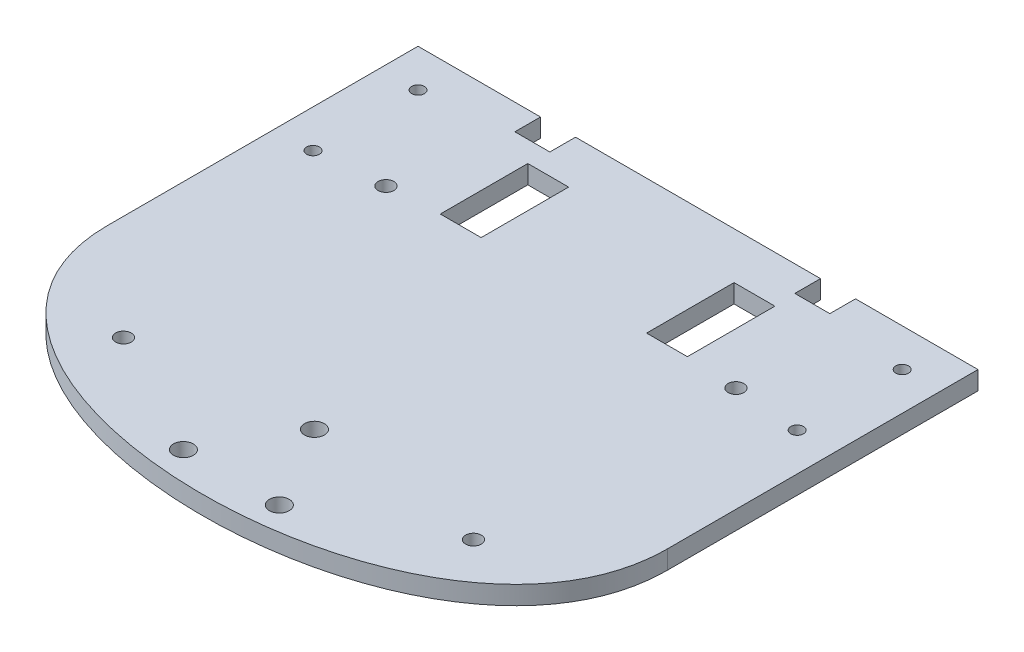
ISO-10303-21;
HEADER;
FILE_DESCRIPTION(('STEP AP214'),'2;1');
FILE_NAME('part.step','',(''),(''),'','','');
FILE_SCHEMA(('AUTOMOTIVE_DESIGN { 1 0 10303 214 1 1 1 1 }'));
ENDSEC;
DATA;
#1=APPLICATION_CONTEXT('core data for automotive mechanical design processes');
#2=APPLICATION_PROTOCOL_DEFINITION('international standard','automotive_design',2000,#1);
#3=PRODUCT_CONTEXT('',#1,'mechanical');
#4=PRODUCT('Part','Part','',(#3));
#5=PRODUCT_RELATED_PRODUCT_CATEGORY('part','',(#4));
#6=PRODUCT_DEFINITION_FORMATION('','',#4);
#7=PRODUCT_DEFINITION_CONTEXT('part definition',#1,'design');
#8=PRODUCT_DEFINITION('design','',#6,#7);
#9=PRODUCT_DEFINITION_SHAPE('','',#8);
#10=(LENGTH_UNIT() NAMED_UNIT(*) SI_UNIT(.MILLI.,.METRE.));
#11=(NAMED_UNIT(*) PLANE_ANGLE_UNIT() SI_UNIT($,.RADIAN.));
#12=(NAMED_UNIT(*) SI_UNIT($,.STERADIAN.) SOLID_ANGLE_UNIT());
#13=UNCERTAINTY_MEASURE_WITH_UNIT(LENGTH_MEASURE(1.E-05),#10,'distance_accuracy_value','');
#14=(GEOMETRIC_REPRESENTATION_CONTEXT(3) GLOBAL_UNCERTAINTY_ASSIGNED_CONTEXT((#13)) GLOBAL_UNIT_ASSIGNED_CONTEXT((#10,
#11,#12)) REPRESENTATION_CONTEXT('',''));
#15=CARTESIAN_POINT('',(0.,0.,0.));
#16=DIRECTION('',(0.,0.,1.));
#17=DIRECTION('',(1.,0.,0.));
#18=AXIS2_PLACEMENT_3D('',#15,#16,#17);
#19=CARTESIAN_POINT('',(48.,3.175,-42.5));
#20=DIRECTION('',(0.,0.,1.));
#21=DIRECTION('',(1.,0.,0.));
#22=AXIS2_PLACEMENT_3D('',#19,#20,#21);
#23=PLANE('',#22);
#24=DIRECTION('',(-1.,0.,0.));
#25=VECTOR('',#24,1.);
#26=CARTESIAN_POINT('',(48.,3.175,-42.5));
#27=LINE('',#26,#25);
#28=CARTESIAN_POINT('',(21.,3.175,-42.5));
#29=VERTEX_POINT('',#28);
#30=CARTESIAN_POINT('',(-21.,3.175,-42.4999999999998));
#31=VERTEX_POINT('',#30);
#32=EDGE_CURVE('E578',#29,#31,#27,.T.);
#33=ORIENTED_EDGE('',*,*,#32,.F.);
#34=DIRECTION('',(0.,1.,0.));
#35=VECTOR('',#34,1.);
#36=CARTESIAN_POINT('',(21.,0.,-42.5));
#37=LINE('',#36,#35);
#38=CARTESIAN_POINT('',(21.,0.,-42.5));
#39=VERTEX_POINT('',#38);
#40=EDGE_CURVE('E215',#39,#29,#37,.T.);
#41=ORIENTED_EDGE('',*,*,#40,.F.);
#42=DIRECTION('',(-1.,0.,0.));
#43=VECTOR('',#42,1.);
#44=CARTESIAN_POINT('',(48.,0.,-42.5));
#45=LINE('',#44,#43);
#46=CARTESIAN_POINT('',(-21.,0.,-42.4999999999998));
#47=VERTEX_POINT('',#46);
#48=EDGE_CURVE('E200',#39,#47,#45,.T.);
#49=ORIENTED_EDGE('',*,*,#48,.T.);
#50=DIRECTION('',(0.,1.,0.));
#51=VECTOR('',#50,1.);
#52=CARTESIAN_POINT('',(-21.,0.,-42.4999999999998));
#53=LINE('',#52,#51);
#54=EDGE_CURVE('E249',#47,#31,#53,.T.);
#55=ORIENTED_EDGE('',*,*,#54,.T.);
#56=EDGE_LOOP('',(#33,#41,#49,#55));
#57=FACE_BOUND('',#56,.T.);
#58=ADVANCED_FACE('F39',(#57),#23,.F.);
#59=CARTESIAN_POINT('',(-27.,3.175,-42.4999999999998));
#60=VERTEX_POINT('',#59);
#61=CARTESIAN_POINT('',(-48.,3.175,-42.5));
#62=VERTEX_POINT('',#61);
#63=EDGE_CURVE('E583',#60,#62,#27,.T.);
#64=ORIENTED_EDGE('',*,*,#63,.F.);
#65=DIRECTION('',(0.,1.,0.));
#66=VECTOR('',#65,1.);
#67=CARTESIAN_POINT('',(-27.,0.,-42.4999999999998));
#68=LINE('',#67,#66);
#69=CARTESIAN_POINT('',(-27.,0.,-42.4999999999998));
#70=VERTEX_POINT('',#69);
#71=EDGE_CURVE('E212',#70,#60,#68,.T.);
#72=ORIENTED_EDGE('',*,*,#71,.F.);
#73=CARTESIAN_POINT('',(-48.,0.,-42.5));
#74=VERTEX_POINT('',#73);
#75=EDGE_CURVE('E603',#70,#74,#45,.T.);
#76=ORIENTED_EDGE('',*,*,#75,.T.);
#77=DIRECTION('',(0.,-1.,0.));
#78=VECTOR('',#77,1.);
#79=CARTESIAN_POINT('',(-48.,3.175,-42.5));
#80=LINE('',#79,#78);
#81=EDGE_CURVE('E587',#62,#74,#80,.T.);
#82=ORIENTED_EDGE('',*,*,#81,.F.);
#83=EDGE_LOOP('',(#64,#72,#76,#82));
#84=FACE_BOUND('',#83,.T.);
#85=ADVANCED_FACE('F469',(#84),#23,.F.);
#86=CARTESIAN_POINT('',(-48.,3.175,-42.5));
#87=DIRECTION('',(1.,0.,0.));
#88=DIRECTION('',(0.,0.,-1.));
#89=AXIS2_PLACEMENT_3D('',#86,#87,#88);
#90=PLANE('',#89);
#91=DIRECTION('',(0.,0.,1.));
#92=VECTOR('',#91,1.);
#93=CARTESIAN_POINT('',(-48.,0.,-42.5));
#94=LINE('',#93,#92);
#95=CARTESIAN_POINT('',(-48.,0.,10.75));
#96=VERTEX_POINT('',#95);
#97=EDGE_CURVE('E439',#74,#96,#94,.T.);
#98=ORIENTED_EDGE('',*,*,#97,.T.);
#99=DIRECTION('',(0.,-1.,0.));
#100=VECTOR('',#99,1.);
#101=CARTESIAN_POINT('',(-48.,3.175,10.75));
#102=LINE('',#101,#100);
#103=CARTESIAN_POINT('',(-48.,3.175,10.75));
#104=VERTEX_POINT('',#103);
#105=EDGE_CURVE('E11',#104,#96,#102,.T.);
#106=ORIENTED_EDGE('',*,*,#105,.F.);
#107=DIRECTION('',(0.,0.,1.));
#108=VECTOR('',#107,1.);
#109=CARTESIAN_POINT('',(-48.,3.175,-42.5));
#110=LINE('',#109,#108);
#111=EDGE_CURVE('E440',#62,#104,#110,.T.);
#112=ORIENTED_EDGE('',*,*,#111,.F.);
#113=ORIENTED_EDGE('',*,*,#81,.T.);
#114=EDGE_LOOP('',(#98,#106,#112,#113));
#115=FACE_BOUND('',#114,.T.);
#116=ADVANCED_FACE('F41',(#115),#90,.F.);
#117=CARTESIAN_POINT('',(-48.,3.175,10.75));
#118=CARTESIAN_POINT('',(-48.,3.175,53.0833333333333));
#119=CARTESIAN_POINT('',(48.0000000000003,3.175,53.0833333333333));
#120=CARTESIAN_POINT('',(48.,3.175,10.75));
#121=B_SPLINE_CURVE_WITH_KNOTS('',3,(#117,#118,#119,#120),.UNSPECIFIED.,.F.,.F.,(4,4),(0.,1.),.UNSPECIFIED.);
#122=DIRECTION('',(0.,-1.,0.));
#123=VECTOR('',#122,1.);
#124=SURFACE_OF_LINEAR_EXTRUSION('',#121,#123);
#125=CARTESIAN_POINT('',(-48.,0.,10.75));
#126=CARTESIAN_POINT('',(-48.,0.,53.0833333333333));
#127=CARTESIAN_POINT('',(48.0000000000003,0.,53.0833333333333));
#128=CARTESIAN_POINT('',(48.,0.,10.75));
#129=B_SPLINE_CURVE_WITH_KNOTS('',3,(#125,#126,#127,#128),.UNSPECIFIED.,.F.,.F.,(4,4),(0.,1.),.UNSPECIFIED.);
#130=CARTESIAN_POINT('',(48.,0.,10.75));
#131=VERTEX_POINT('',#130);
#132=EDGE_CURVE('E592',#96,#131,#129,.T.);
#133=ORIENTED_EDGE('',*,*,#132,.T.);
#134=DIRECTION('',(0.,-1.,0.));
#135=VECTOR('',#134,1.);
#136=CARTESIAN_POINT('',(48.,3.175,10.75));
#137=LINE('',#136,#135);
#138=CARTESIAN_POINT('',(48.,3.175,10.75));
#139=VERTEX_POINT('',#138);
#140=EDGE_CURVE('E48',#139,#131,#137,.T.);
#141=ORIENTED_EDGE('',*,*,#140,.F.);
#142=EDGE_CURVE('E444',#104,#139,#121,.T.);
#143=ORIENTED_EDGE('',*,*,#142,.F.);
#144=ORIENTED_EDGE('',*,*,#105,.T.);
#145=EDGE_LOOP('',(#133,#141,#143,#144));
#146=FACE_BOUND('',#145,.T.);
#147=ADVANCED_FACE('F456',(#146),#124,.F.);
#148=CARTESIAN_POINT('',(48.,3.175,-42.5));
#149=DIRECTION('',(-1.,0.,0.));
#150=DIRECTION('',(0.,0.,1.));
#151=AXIS2_PLACEMENT_3D('',#148,#149,#150);
#152=PLANE('',#151);
#153=DIRECTION('',(0.,0.,-1.));
#154=VECTOR('',#153,1.);
#155=CARTESIAN_POINT('',(48.,0.,-42.5));
#156=LINE('',#155,#154);
#157=CARTESIAN_POINT('',(48.,0.,-42.5));
#158=VERTEX_POINT('',#157);
#159=EDGE_CURVE('E597',#131,#158,#156,.T.);
#160=ORIENTED_EDGE('',*,*,#159,.T.);
#161=DIRECTION('',(0.,-1.,0.));
#162=VECTOR('',#161,1.);
#163=CARTESIAN_POINT('',(48.,3.175,-42.5));
#164=LINE('',#163,#162);
#165=CARTESIAN_POINT('',(48.,3.175,-42.5));
#166=VERTEX_POINT('',#165);
#167=EDGE_CURVE('E610',#166,#158,#164,.T.);
#168=ORIENTED_EDGE('',*,*,#167,.F.);
#169=DIRECTION('',(0.,0.,-1.));
#170=VECTOR('',#169,1.);
#171=CARTESIAN_POINT('',(48.,3.175,-42.5));
#172=LINE('',#171,#170);
#173=EDGE_CURVE('E451',#139,#166,#172,.T.);
#174=ORIENTED_EDGE('',*,*,#173,.F.);
#175=ORIENTED_EDGE('',*,*,#140,.T.);
#176=EDGE_LOOP('',(#160,#168,#174,#175));
#177=FACE_BOUND('',#176,.T.);
#178=ADVANCED_FACE('F459',(#177),#152,.F.);
#179=CARTESIAN_POINT('',(27.,0.,-42.5));
#180=VERTEX_POINT('',#179);
#181=EDGE_CURVE('E445',#158,#180,#45,.T.);
#182=ORIENTED_EDGE('',*,*,#181,.T.);
#183=DIRECTION('',(0.,1.,0.));
#184=VECTOR('',#183,1.);
#185=CARTESIAN_POINT('',(27.,0.,-42.5));
#186=LINE('',#185,#184);
#187=CARTESIAN_POINT('',(27.,3.175,-42.5));
#188=VERTEX_POINT('',#187);
#189=EDGE_CURVE('E219',#180,#188,#186,.T.);
#190=ORIENTED_EDGE('',*,*,#189,.T.);
#191=EDGE_CURVE('E582',#166,#188,#27,.T.);
#192=ORIENTED_EDGE('',*,*,#191,.F.);
#193=ORIENTED_EDGE('',*,*,#167,.T.);
#194=EDGE_LOOP('',(#182,#190,#192,#193));
#195=FACE_BOUND('',#194,.T.);
#196=ADVANCED_FACE('F463',(#195),#23,.F.);
#197=CARTESIAN_POINT('',(1.21430643318376E-13,3.175,42.5));
#198=DIRECTION('',(0.,-1.,0.));
#199=DIRECTION('',(0.,0.,-1.));
#200=AXIS2_PLACEMENT_3D('',#197,#198,#199);
#201=PLANE('',#200);
#202=CARTESIAN_POINT('',(30.,3.175,26.));
#203=DIRECTION('',(0.,-1.,0.));
#204=DIRECTION('',(0.,0.,-1.));
#205=AXIS2_PLACEMENT_3D('',#202,#203,#204);
#206=CIRCLE('',#205,1.35000000000004);
#207=CARTESIAN_POINT('',(30.,3.175,24.65));
#208=VERTEX_POINT('',#207);
#209=EDGE_CURVE('E435',#208,#208,#206,.T.);
#210=ORIENTED_EDGE('',*,*,#209,.T.);
#211=EDGE_LOOP('',(#210));
#212=FACE_BOUND('',#211,.T.);
#213=CARTESIAN_POINT('',(-30.,3.175,26.));
#214=DIRECTION('',(0.,-1.,0.));
#215=DIRECTION('',(0.,0.,-1.));
#216=AXIS2_PLACEMENT_3D('',#213,#214,#215);
#217=CIRCLE('',#216,1.35);
#218=CARTESIAN_POINT('',(-30.,3.175,24.65));
#219=VERTEX_POINT('',#218);
#220=EDGE_CURVE('E431',#219,#219,#217,.T.);
#221=ORIENTED_EDGE('',*,*,#220,.T.);
#222=EDGE_LOOP('',(#221));
#223=FACE_BOUND('',#222,.T.);
#224=CARTESIAN_POINT('',(41.5,3.175,-36.));
#225=DIRECTION('',(0.,-1.,0.));
#226=DIRECTION('',(0.,0.,-1.));
#227=AXIS2_PLACEMENT_3D('',#224,#225,#226);
#228=CIRCLE('',#227,1.09219999999998);
#229=CARTESIAN_POINT('',(41.5,3.175,-37.0922));
#230=VERTEX_POINT('',#229);
#231=EDGE_CURVE('E427',#230,#230,#228,.T.);
#232=ORIENTED_EDGE('',*,*,#231,.T.);
#233=EDGE_LOOP('',(#232));
#234=FACE_BOUND('',#233,.T.);
#235=CARTESIAN_POINT('',(41.5,3.175,-18.));
#236=DIRECTION('',(0.,-1.,0.));
#237=DIRECTION('',(0.,0.,-1.));
#238=AXIS2_PLACEMENT_3D('',#235,#236,#237);
#239=CIRCLE('',#238,1.09219999999998);
#240=CARTESIAN_POINT('',(41.5,3.175,-19.0922));
#241=VERTEX_POINT('',#240);
#242=EDGE_CURVE('E423',#241,#241,#239,.T.);
#243=ORIENTED_EDGE('',*,*,#242,.T.);
#244=EDGE_LOOP('',(#243));
#245=FACE_BOUND('',#244,.T.);
#246=CARTESIAN_POINT('',(0.,3.175,23.253882107746));
#247=DIRECTION('',(0.,-1.,0.));
#248=DIRECTION('',(0.,0.,-1.));
#249=AXIS2_PLACEMENT_3D('',#246,#247,#248);
#250=CIRCLE('',#249,1.7);
#251=CARTESIAN_POINT('',(0.,3.175,21.553882107746));
#252=VERTEX_POINT('',#251);
#253=EDGE_CURVE('E419',#252,#252,#250,.T.);
#254=ORIENTED_EDGE('',*,*,#253,.T.);
#255=EDGE_LOOP('',(#254));
#256=FACE_BOUND('',#255,.T.);
#257=CARTESIAN_POINT('',(-41.5,3.175,-36.));
#258=DIRECTION('',(0.,-1.,0.));
#259=DIRECTION('',(0.,0.,-1.));
#260=AXIS2_PLACEMENT_3D('',#257,#258,#259);
#261=CIRCLE('',#260,1.0922);
#262=CARTESIAN_POINT('',(-41.5,3.175,-37.0922));
#263=VERTEX_POINT('',#262);
#264=EDGE_CURVE('E415',#263,#263,#261,.T.);
#265=ORIENTED_EDGE('',*,*,#264,.T.);
#266=EDGE_LOOP('',(#265));
#267=FACE_BOUND('',#266,.T.);
#268=CARTESIAN_POINT('',(-30.,3.175,-19.));
#269=DIRECTION('',(0.,-1.,0.));
#270=DIRECTION('',(0.,0.,-1.));
#271=AXIS2_PLACEMENT_3D('',#268,#269,#270);
#272=CIRCLE('',#271,1.35);
#273=CARTESIAN_POINT('',(-30.,3.175,-20.35));
#274=VERTEX_POINT('',#273);
#275=EDGE_CURVE('E411',#274,#274,#272,.T.);
#276=ORIENTED_EDGE('',*,*,#275,.T.);
#277=EDGE_LOOP('',(#276));
#278=FACE_BOUND('',#277,.T.);
#279=CARTESIAN_POINT('',(-41.5,3.175,-18.));
#280=DIRECTION('',(0.,-1.,0.));
#281=DIRECTION('',(0.,0.,-1.));
#282=AXIS2_PLACEMENT_3D('',#279,#280,#281);
#283=CIRCLE('',#282,1.0922);
#284=CARTESIAN_POINT('',(-41.5,3.175,-19.0922));
#285=VERTEX_POINT('',#284);
#286=EDGE_CURVE('E407',#285,#285,#283,.T.);
#287=ORIENTED_EDGE('',*,*,#286,.T.);
#288=EDGE_LOOP('',(#287));
#289=FACE_BOUND('',#288,.T.);
#290=CARTESIAN_POINT('',(8.225,3.175,37.5));
#291=DIRECTION('',(0.,-1.,0.));
#292=DIRECTION('',(0.,0.,-1.));
#293=AXIS2_PLACEMENT_3D('',#290,#291,#292);
#294=CIRCLE('',#293,1.7);
#295=CARTESIAN_POINT('',(8.225,3.175,35.8));
#296=VERTEX_POINT('',#295);
#297=EDGE_CURVE('E403',#296,#296,#294,.T.);
#298=ORIENTED_EDGE('',*,*,#297,.T.);
#299=EDGE_LOOP('',(#298));
#300=FACE_BOUND('',#299,.T.);
#301=DIRECTION('',(-1.,0.,0.));
#302=VECTOR('',#301,1.);
#303=CARTESIAN_POINT('',(1.52160030607109E-13,3.175,-19.5));
#304=LINE('',#303,#302);
#305=CARTESIAN_POINT('',(-14.18,3.175,-19.5));
#306=VERTEX_POINT('',#305);
#307=CARTESIAN_POINT('',(-21.18,3.175,-19.5));
#308=VERTEX_POINT('',#307);
#309=EDGE_CURVE('E387',#306,#308,#304,.T.);
#310=ORIENTED_EDGE('',*,*,#309,.T.);
#311=DIRECTION('',(0.,0.,-1.));
#312=VECTOR('',#311,1.);
#313=CARTESIAN_POINT('',(-21.18,3.175,42.5));
#314=LINE('',#313,#312);
#315=CARTESIAN_POINT('',(-21.18,3.175,-34.5));
#316=VERTEX_POINT('',#315);
#317=EDGE_CURVE('E399',#308,#316,#314,.T.);
#318=ORIENTED_EDGE('',*,*,#317,.T.);
#319=DIRECTION('',(1.,0.,0.));
#320=VECTOR('',#319,1.);
#321=CARTESIAN_POINT('',(1.21430643318376E-13,3.175,-34.5));
#322=LINE('',#321,#320);
#323=CARTESIAN_POINT('',(-14.18,3.175,-34.5));
#324=VERTEX_POINT('',#323);
#325=EDGE_CURVE('E395',#316,#324,#322,.T.);
#326=ORIENTED_EDGE('',*,*,#325,.T.);
#327=DIRECTION('',(0.,0.,1.));
#328=VECTOR('',#327,1.);
#329=CARTESIAN_POINT('',(-14.18,3.175,42.5));
#330=LINE('',#329,#328);
#331=EDGE_CURVE('E391',#324,#306,#330,.T.);
#332=ORIENTED_EDGE('',*,*,#331,.T.);
#333=EDGE_LOOP('',(#310,#318,#326,#332));
#334=FACE_BOUND('',#333,.T.);
#335=CARTESIAN_POINT('',(-8.225,3.175,37.5));
#336=DIRECTION('',(0.,-1.,0.));
#337=DIRECTION('',(0.,0.,-1.));
#338=AXIS2_PLACEMENT_3D('',#335,#336,#337);
#339=CIRCLE('',#338,1.7);
#340=CARTESIAN_POINT('',(-8.225,3.175,35.8));
#341=VERTEX_POINT('',#340);
#342=EDGE_CURVE('E383',#341,#341,#339,.T.);
#343=ORIENTED_EDGE('',*,*,#342,.T.);
#344=EDGE_LOOP('',(#343));
#345=FACE_BOUND('',#344,.T.);
#346=CARTESIAN_POINT('',(30.,3.175,-19.));
#347=DIRECTION('',(0.,-1.,0.));
#348=DIRECTION('',(0.,0.,-1.));
#349=AXIS2_PLACEMENT_3D('',#346,#347,#348);
#350=CIRCLE('',#349,1.35);
#351=CARTESIAN_POINT('',(30.,3.175,-20.35));
#352=VERTEX_POINT('',#351);
#353=EDGE_CURVE('E379',#352,#352,#350,.T.);
#354=ORIENTED_EDGE('',*,*,#353,.T.);
#355=EDGE_LOOP('',(#354));
#356=FACE_BOUND('',#355,.T.);
#357=DIRECTION('',(-1.,0.,0.));
#358=VECTOR('',#357,1.);
#359=CARTESIAN_POINT('',(1.21430643318376E-13,3.175,-19.5));
#360=LINE('',#359,#358);
#361=CARTESIAN_POINT('',(21.18,3.175,-19.5));
#362=VERTEX_POINT('',#361);
#363=CARTESIAN_POINT('',(14.18,3.175,-19.5));
#364=VERTEX_POINT('',#363);
#365=EDGE_CURVE('E353',#362,#364,#360,.T.);
#366=ORIENTED_EDGE('',*,*,#365,.T.);
#367=DIRECTION('',(0.,0.,-1.));
#368=VECTOR('',#367,1.);
#369=CARTESIAN_POINT('',(14.18,3.175,42.5));
#370=LINE('',#369,#368);
#371=CARTESIAN_POINT('',(14.18,3.175,-34.5));
#372=VERTEX_POINT('',#371);
#373=EDGE_CURVE('E375',#364,#372,#370,.T.);
#374=ORIENTED_EDGE('',*,*,#373,.T.);
#375=DIRECTION('',(1.,0.,0.));
#376=VECTOR('',#375,1.);
#377=CARTESIAN_POINT('',(1.21430643318376E-13,3.175,-34.5));
#378=LINE('',#377,#376);
#379=CARTESIAN_POINT('',(21.18,3.175,-34.5));
#380=VERTEX_POINT('',#379);
#381=EDGE_CURVE('E371',#372,#380,#378,.T.);
#382=ORIENTED_EDGE('',*,*,#381,.T.);
#383=DIRECTION('',(0.,0.,1.));
#384=VECTOR('',#383,1.);
#385=CARTESIAN_POINT('',(21.18,3.175,42.5));
#386=LINE('',#385,#384);
#387=EDGE_CURVE('E367',#380,#362,#386,.T.);
#388=ORIENTED_EDGE('',*,*,#387,.T.);
#389=EDGE_LOOP('',(#366,#374,#382,#388));
#390=FACE_BOUND('',#389,.T.);
#391=DIRECTION('',(1.,0.,0.));
#392=VECTOR('',#391,1.);
#393=CARTESIAN_POINT('',(21.,3.175,-38.1));
#394=LINE('',#393,#392);
#395=CARTESIAN_POINT('',(21.,3.175,-38.1));
#396=VERTEX_POINT('',#395);
#397=CARTESIAN_POINT('',(27.,3.175,-38.1));
#398=VERTEX_POINT('',#397);
#399=EDGE_CURVE('E205',#396,#398,#394,.T.);
#400=ORIENTED_EDGE('',*,*,#399,.F.);
#401=DIRECTION('',(0.,0.,1.));
#402=VECTOR('',#401,1.);
#403=CARTESIAN_POINT('',(21.,3.175,-42.5));
#404=LINE('',#403,#402);
#405=EDGE_CURVE('E183',#29,#396,#404,.T.);
#406=ORIENTED_EDGE('',*,*,#405,.F.);
#407=ORIENTED_EDGE('',*,*,#32,.T.);
#408=DIRECTION('',(0.,0.,-1.));
#409=VECTOR('',#408,1.);
#410=CARTESIAN_POINT('',(-21.,3.175,-42.4999999999998));
#411=LINE('',#410,#409);
#412=CARTESIAN_POINT('',(-21.,3.175,-38.1));
#413=VERTEX_POINT('',#412);
#414=EDGE_CURVE('E230',#413,#31,#411,.T.);
#415=ORIENTED_EDGE('',*,*,#414,.F.);
#416=DIRECTION('',(1.,0.,0.));
#417=VECTOR('',#416,1.);
#418=CARTESIAN_POINT('',(-27.,3.175,-38.1));
#419=LINE('',#418,#417);
#420=CARTESIAN_POINT('',(-27.,3.175,-38.1));
#421=VERTEX_POINT('',#420);
#422=EDGE_CURVE('E241',#421,#413,#419,.T.);
#423=ORIENTED_EDGE('',*,*,#422,.F.);
#424=DIRECTION('',(0.,0.,1.));
#425=VECTOR('',#424,1.);
#426=CARTESIAN_POINT('',(-27.,3.175,-42.4999999999998));
#427=LINE('',#426,#425);
#428=EDGE_CURVE('E237',#60,#421,#427,.T.);
#429=ORIENTED_EDGE('',*,*,#428,.F.);
#430=ORIENTED_EDGE('',*,*,#63,.T.);
#431=ORIENTED_EDGE('',*,*,#111,.T.);
#432=ORIENTED_EDGE('',*,*,#142,.T.);
#433=ORIENTED_EDGE('',*,*,#173,.T.);
#434=ORIENTED_EDGE('',*,*,#191,.T.);
#435=DIRECTION('',(0.,0.,-1.));
#436=VECTOR('',#435,1.);
#437=CARTESIAN_POINT('',(27.,3.175,-42.5));
#438=LINE('',#437,#436);
#439=EDGE_CURVE('E202',#398,#188,#438,.T.);
#440=ORIENTED_EDGE('',*,*,#439,.F.);
#441=EDGE_LOOP('',(#400,#406,#407,#415,#423,#429,#430,#431,#432,#433,#434,#440));
#442=FACE_BOUND('',#441,.T.);
#443=ADVANCED_FACE('F467',(#212,#223,#234,#245,#256,#267,#278,#289,#300,#334,#345,#356,#390,
#442),#201,.F.);
#444=CARTESIAN_POINT('',(1.21430643318376E-13,0.,42.5));
#445=DIRECTION('',(0.,-1.,0.));
#446=DIRECTION('',(0.,0.,-1.));
#447=AXIS2_PLACEMENT_3D('',#444,#445,#446);
#448=PLANE('',#447);
#449=DIRECTION('',(0.,0.,1.));
#450=VECTOR('',#449,1.);
#451=CARTESIAN_POINT('',(21.,0.,-42.5));
#452=LINE('',#451,#450);
#453=CARTESIAN_POINT('',(21.,0.,-38.1));
#454=VERTEX_POINT('',#453);
#455=EDGE_CURVE('E180',#39,#454,#452,.T.);
#456=ORIENTED_EDGE('',*,*,#455,.T.);
#457=DIRECTION('',(1.,0.,0.));
#458=VECTOR('',#457,1.);
#459=CARTESIAN_POINT('',(21.,0.,-38.1));
#460=LINE('',#459,#458);
#461=CARTESIAN_POINT('',(27.,0.,-38.1));
#462=VERTEX_POINT('',#461);
#463=EDGE_CURVE('E191',#454,#462,#460,.T.);
#464=ORIENTED_EDGE('',*,*,#463,.T.);
#465=DIRECTION('',(0.,0.,-1.));
#466=VECTOR('',#465,1.);
#467=CARTESIAN_POINT('',(27.,0.,-42.5));
#468=LINE('',#467,#466);
#469=EDGE_CURVE('E55',#462,#180,#468,.T.);
#470=ORIENTED_EDGE('',*,*,#469,.T.);
#471=ORIENTED_EDGE('',*,*,#181,.F.);
#472=ORIENTED_EDGE('',*,*,#159,.F.);
#473=ORIENTED_EDGE('',*,*,#132,.F.);
#474=ORIENTED_EDGE('',*,*,#97,.F.);
#475=ORIENTED_EDGE('',*,*,#75,.F.);
#476=DIRECTION('',(0.,0.,1.));
#477=VECTOR('',#476,1.);
#478=CARTESIAN_POINT('',(-27.,0.,-42.4999999999998));
#479=LINE('',#478,#477);
#480=CARTESIAN_POINT('',(-27.,0.,-38.1));
#481=VERTEX_POINT('',#480);
#482=EDGE_CURVE('E225',#70,#481,#479,.T.);
#483=ORIENTED_EDGE('',*,*,#482,.T.);
#484=DIRECTION('',(1.,0.,0.));
#485=VECTOR('',#484,1.);
#486=CARTESIAN_POINT('',(-27.,0.,-38.1));
#487=LINE('',#486,#485);
#488=CARTESIAN_POINT('',(-21.,0.,-38.1));
#489=VERTEX_POINT('',#488);
#490=EDGE_CURVE('E229',#481,#489,#487,.T.);
#491=ORIENTED_EDGE('',*,*,#490,.T.);
#492=DIRECTION('',(0.,0.,-1.));
#493=VECTOR('',#492,1.);
#494=CARTESIAN_POINT('',(-21.,0.,-42.4999999999998));
#495=LINE('',#494,#493);
#496=EDGE_CURVE('E63',#489,#47,#495,.T.);
#497=ORIENTED_EDGE('',*,*,#496,.T.);
#498=ORIENTED_EDGE('',*,*,#48,.F.);
#499=EDGE_LOOP('',(#456,#464,#470,#471,#472,#473,#474,#475,#483,#491,#497,#498));
#500=FACE_BOUND('',#499,.T.);
#501=CARTESIAN_POINT('',(30.,0.,26.));
#502=DIRECTION('',(0.,1.,0.));
#503=DIRECTION('',(0.,0.,-1.));
#504=AXIS2_PLACEMENT_3D('',#501,#502,#503);
#505=CIRCLE('',#504,1.35000000000004);
#506=CARTESIAN_POINT('',(30.,0.,24.65));
#507=VERTEX_POINT('',#506);
#508=EDGE_CURVE('E297',#507,#507,#505,.T.);
#509=ORIENTED_EDGE('',*,*,#508,.T.);
#510=EDGE_LOOP('',(#509));
#511=FACE_BOUND('',#510,.T.);
#512=CARTESIAN_POINT('',(-30.,0.,26.));
#513=DIRECTION('',(0.,1.,0.));
#514=DIRECTION('',(0.,0.,1.));
#515=AXIS2_PLACEMENT_3D('',#512,#513,#514);
#516=CIRCLE('',#515,1.35);
#517=CARTESIAN_POINT('',(-30.,0.,27.35));
#518=VERTEX_POINT('',#517);
#519=EDGE_CURVE('E310',#518,#518,#516,.T.);
#520=ORIENTED_EDGE('',*,*,#519,.T.);
#521=EDGE_LOOP('',(#520));
#522=FACE_BOUND('',#521,.T.);
#523=CARTESIAN_POINT('',(41.5,0.,-36.));
#524=DIRECTION('',(0.,1.,0.));
#525=DIRECTION('',(0.,0.,-1.));
#526=AXIS2_PLACEMENT_3D('',#523,#524,#525);
#527=CIRCLE('',#526,1.09219999999998);
#528=CARTESIAN_POINT('',(41.5,0.,-37.0922));
#529=VERTEX_POINT('',#528);
#530=EDGE_CURVE('E306',#529,#529,#527,.T.);
#531=ORIENTED_EDGE('',*,*,#530,.T.);
#532=EDGE_LOOP('',(#531));
#533=FACE_BOUND('',#532,.T.);
#534=CARTESIAN_POINT('',(41.5,0.,-18.));
#535=DIRECTION('',(0.,1.,0.));
#536=DIRECTION('',(0.,0.,-1.));
#537=AXIS2_PLACEMENT_3D('',#534,#535,#536);
#538=CIRCLE('',#537,1.09219999999998);
#539=CARTESIAN_POINT('',(41.5,0.,-19.0922));
#540=VERTEX_POINT('',#539);
#541=EDGE_CURVE('E301',#540,#540,#538,.T.);
#542=ORIENTED_EDGE('',*,*,#541,.T.);
#543=EDGE_LOOP('',(#542));
#544=FACE_BOUND('',#543,.T.);
#545=CARTESIAN_POINT('',(0.,0.,23.253882107746));
#546=DIRECTION('',(0.,1.,0.));
#547=DIRECTION('',(0.,0.,-1.));
#548=AXIS2_PLACEMENT_3D('',#545,#546,#547);
#549=CIRCLE('',#548,1.7);
#550=CARTESIAN_POINT('',(0.,0.,21.553882107746));
#551=VERTEX_POINT('',#550);
#552=EDGE_CURVE('E325',#551,#551,#549,.T.);
#553=ORIENTED_EDGE('',*,*,#552,.T.);
#554=EDGE_LOOP('',(#553));
#555=FACE_BOUND('',#554,.T.);
#556=CARTESIAN_POINT('',(-41.5,0.,-36.));
#557=DIRECTION('',(0.,1.,0.));
#558=DIRECTION('',(0.,0.,1.));
#559=AXIS2_PLACEMENT_3D('',#556,#557,#558);
#560=CIRCLE('',#559,1.0922);
#561=CARTESIAN_POINT('',(-41.5,0.,-34.9078));
#562=VERTEX_POINT('',#561);
#563=EDGE_CURVE('E321',#562,#562,#560,.T.);
#564=ORIENTED_EDGE('',*,*,#563,.T.);
#565=EDGE_LOOP('',(#564));
#566=FACE_BOUND('',#565,.T.);
#567=CARTESIAN_POINT('',(-30.,0.,-19.));
#568=DIRECTION('',(0.,1.,0.));
#569=DIRECTION('',(0.,0.,1.));
#570=AXIS2_PLACEMENT_3D('',#567,#568,#569);
#571=CIRCLE('',#570,1.35);
#572=CARTESIAN_POINT('',(-30.,0.,-17.65));
#573=VERTEX_POINT('',#572);
#574=EDGE_CURVE('E317',#573,#573,#571,.T.);
#575=ORIENTED_EDGE('',*,*,#574,.T.);
#576=EDGE_LOOP('',(#575));
#577=FACE_BOUND('',#576,.T.);
#578=CARTESIAN_POINT('',(-41.5,0.,-18.));
#579=DIRECTION('',(0.,1.,0.));
#580=DIRECTION('',(0.,0.,1.));
#581=AXIS2_PLACEMENT_3D('',#578,#579,#580);
#582=CIRCLE('',#581,1.0922);
#583=CARTESIAN_POINT('',(-41.5,0.,-16.9078));
#584=VERTEX_POINT('',#583);
#585=EDGE_CURVE('E305',#584,#584,#582,.T.);
#586=ORIENTED_EDGE('',*,*,#585,.T.);
#587=EDGE_LOOP('',(#586));
#588=FACE_BOUND('',#587,.T.);
#589=CARTESIAN_POINT('',(8.225,0.,37.5));
#590=DIRECTION('',(0.,1.,0.));
#591=DIRECTION('',(0.,0.,-1.));
#592=AXIS2_PLACEMENT_3D('',#589,#590,#591);
#593=CIRCLE('',#592,1.7);
#594=CARTESIAN_POINT('',(8.225,0.,35.8));
#595=VERTEX_POINT('',#594);
#596=EDGE_CURVE('E218',#595,#595,#593,.T.);
#597=ORIENTED_EDGE('',*,*,#596,.T.);
#598=EDGE_LOOP('',(#597));
#599=FACE_BOUND('',#598,.T.);
#600=DIRECTION('',(0.,0.,1.));
#601=VECTOR('',#600,1.);
#602=CARTESIAN_POINT('',(-21.18,0.,-34.5));
#603=LINE('',#602,#601);
#604=CARTESIAN_POINT('',(-21.18,0.,-34.5));
#605=VERTEX_POINT('',#604);
#606=CARTESIAN_POINT('',(-21.18,0.,-19.5));
#607=VERTEX_POINT('',#606);
#608=EDGE_CURVE('E258',#605,#607,#603,.T.);
#609=ORIENTED_EDGE('',*,*,#608,.T.);
#610=DIRECTION('',(1.,0.,0.));
#611=VECTOR('',#610,1.);
#612=CARTESIAN_POINT('',(-21.18,0.,-19.5));
#613=LINE('',#612,#611);
#614=CARTESIAN_POINT('',(-14.18,0.,-19.5));
#615=VERTEX_POINT('',#614);
#616=EDGE_CURVE('E262',#607,#615,#613,.T.);
#617=ORIENTED_EDGE('',*,*,#616,.T.);
#618=DIRECTION('',(0.,0.,-1.));
#619=VECTOR('',#618,1.);
#620=CARTESIAN_POINT('',(-14.18,0.,-34.5));
#621=LINE('',#620,#619);
#622=CARTESIAN_POINT('',(-14.18,0.,-34.5));
#623=VERTEX_POINT('',#622);
#624=EDGE_CURVE('E266',#615,#623,#621,.T.);
#625=ORIENTED_EDGE('',*,*,#624,.T.);
#626=DIRECTION('',(-1.,0.,0.));
#627=VECTOR('',#626,1.);
#628=CARTESIAN_POINT('',(-21.18,0.,-34.5));
#629=LINE('',#628,#627);
#630=EDGE_CURVE('E270',#623,#605,#629,.T.);
#631=ORIENTED_EDGE('',*,*,#630,.T.);
#632=EDGE_LOOP('',(#609,#617,#625,#631));
#633=FACE_BOUND('',#632,.T.);
#634=CARTESIAN_POINT('',(-8.225,0.,37.5));
#635=DIRECTION('',(0.,1.,0.));
#636=DIRECTION('',(0.,0.,1.));
#637=AXIS2_PLACEMENT_3D('',#634,#635,#636);
#638=CIRCLE('',#637,1.7);
#639=CARTESIAN_POINT('',(-8.225,0.,39.2));
#640=VERTEX_POINT('',#639);
#641=EDGE_CURVE('E279',#640,#640,#638,.T.);
#642=ORIENTED_EDGE('',*,*,#641,.T.);
#643=EDGE_LOOP('',(#642));
#644=FACE_BOUND('',#643,.T.);
#645=CARTESIAN_POINT('',(30.,0.,-19.));
#646=DIRECTION('',(0.,1.,0.));
#647=DIRECTION('',(0.,0.,-1.));
#648=AXIS2_PLACEMENT_3D('',#645,#646,#647);
#649=CIRCLE('',#648,1.35);
#650=CARTESIAN_POINT('',(30.,0.,-20.35));
#651=VERTEX_POINT('',#650);
#652=EDGE_CURVE('E293',#651,#651,#649,.T.);
#653=ORIENTED_EDGE('',*,*,#652,.T.);
#654=EDGE_LOOP('',(#653));
#655=FACE_BOUND('',#654,.T.);
#656=DIRECTION('',(0.,0.,1.));
#657=VECTOR('',#656,1.);
#658=CARTESIAN_POINT('',(14.18,0.,-34.5));
#659=LINE('',#658,#657);
#660=CARTESIAN_POINT('',(14.18,0.,-34.5));
#661=VERTEX_POINT('',#660);
#662=CARTESIAN_POINT('',(14.18,0.,-19.5));
#663=VERTEX_POINT('',#662);
#664=EDGE_CURVE('E329',#661,#663,#659,.T.);
#665=ORIENTED_EDGE('',*,*,#664,.T.);
#666=DIRECTION('',(1.,0.,0.));
#667=VECTOR('',#666,1.);
#668=CARTESIAN_POINT('',(14.18,0.,-19.5));
#669=LINE('',#668,#667);
#670=CARTESIAN_POINT('',(21.18,0.,-19.5));
#671=VERTEX_POINT('',#670);
#672=EDGE_CURVE('E336',#663,#671,#669,.T.);
#673=ORIENTED_EDGE('',*,*,#672,.T.);
#674=DIRECTION('',(0.,0.,-1.));
#675=VECTOR('',#674,1.);
#676=CARTESIAN_POINT('',(21.18,0.,-34.5));
#677=LINE('',#676,#675);
#678=CARTESIAN_POINT('',(21.18,0.,-34.5));
#679=VERTEX_POINT('',#678);
#680=EDGE_CURVE('E340',#671,#679,#677,.T.);
#681=ORIENTED_EDGE('',*,*,#680,.T.);
#682=DIRECTION('',(-1.,0.,0.));
#683=VECTOR('',#682,1.);
#684=CARTESIAN_POINT('',(14.18,0.,-34.5));
#685=LINE('',#684,#683);
#686=EDGE_CURVE('E344',#679,#661,#685,.T.);
#687=ORIENTED_EDGE('',*,*,#686,.T.);
#688=EDGE_LOOP('',(#665,#673,#681,#687));
#689=FACE_BOUND('',#688,.T.);
#690=ADVANCED_FACE('F197',(#500,#511,#522,#533,#544,#555,#566,#577,#588,#599,#633,#644,#655,
#689),#448,.T.);
#691=CARTESIAN_POINT('',(14.18,0.,-34.5));
#692=DIRECTION('',(-1.,0.,0.));
#693=DIRECTION('',(0.,0.,1.));
#694=AXIS2_PLACEMENT_3D('',#691,#692,#693);
#695=PLANE('',#694);
#696=DIRECTION('',(0.,1.,0.));
#697=VECTOR('',#696,1.);
#698=CARTESIAN_POINT('',(14.18,0.,-19.5));
#699=LINE('',#698,#697);
#700=EDGE_CURVE('E348',#663,#364,#699,.T.);
#701=ORIENTED_EDGE('',*,*,#700,.F.);
#702=ORIENTED_EDGE('',*,*,#664,.F.);
#703=DIRECTION('',(0.,1.,0.));
#704=VECTOR('',#703,1.);
#705=CARTESIAN_POINT('',(14.18,0.,-34.5));
#706=LINE('',#705,#704);
#707=EDGE_CURVE('E349',#661,#372,#706,.T.);
#708=ORIENTED_EDGE('',*,*,#707,.T.);
#709=ORIENTED_EDGE('',*,*,#373,.F.);
#710=EDGE_LOOP('',(#701,#702,#708,#709));
#711=FACE_BOUND('',#710,.T.);
#712=ADVANCED_FACE('F472',(#711),#695,.F.);
#713=CARTESIAN_POINT('',(14.18,0.,-34.5));
#714=DIRECTION('',(0.,0.,-1.));
#715=DIRECTION('',(-1.,0.,0.));
#716=AXIS2_PLACEMENT_3D('',#713,#714,#715);
#717=PLANE('',#716);
#718=ORIENTED_EDGE('',*,*,#707,.F.);
#719=ORIENTED_EDGE('',*,*,#686,.F.);
#720=DIRECTION('',(0.,1.,0.));
#721=VECTOR('',#720,1.);
#722=CARTESIAN_POINT('',(21.18,0.,-34.5));
#723=LINE('',#722,#721);
#724=EDGE_CURVE('E354',#679,#380,#723,.T.);
#725=ORIENTED_EDGE('',*,*,#724,.T.);
#726=ORIENTED_EDGE('',*,*,#381,.F.);
#727=EDGE_LOOP('',(#718,#719,#725,#726));
#728=FACE_BOUND('',#727,.T.);
#729=ADVANCED_FACE('F478',(#728),#717,.F.);
#730=CARTESIAN_POINT('',(21.18,0.,-34.5));
#731=DIRECTION('',(1.,0.,0.));
#732=DIRECTION('',(0.,0.,-1.));
#733=AXIS2_PLACEMENT_3D('',#730,#731,#732);
#734=PLANE('',#733);
#735=ORIENTED_EDGE('',*,*,#724,.F.);
#736=ORIENTED_EDGE('',*,*,#680,.F.);
#737=DIRECTION('',(0.,1.,0.));
#738=VECTOR('',#737,1.);
#739=CARTESIAN_POINT('',(21.18,0.,-19.5));
#740=LINE('',#739,#738);
#741=EDGE_CURVE('E358',#671,#362,#740,.T.);
#742=ORIENTED_EDGE('',*,*,#741,.T.);
#743=ORIENTED_EDGE('',*,*,#387,.F.);
#744=EDGE_LOOP('',(#735,#736,#742,#743));
#745=FACE_BOUND('',#744,.T.);
#746=ADVANCED_FACE('F484',(#745),#734,.F.);
#747=CARTESIAN_POINT('',(14.18,0.,-19.5));
#748=DIRECTION('',(0.,0.,1.));
#749=DIRECTION('',(1.,0.,0.));
#750=AXIS2_PLACEMENT_3D('',#747,#748,#749);
#751=PLANE('',#750);
#752=ORIENTED_EDGE('',*,*,#741,.F.);
#753=ORIENTED_EDGE('',*,*,#672,.F.);
#754=ORIENTED_EDGE('',*,*,#700,.T.);
#755=ORIENTED_EDGE('',*,*,#365,.F.);
#756=EDGE_LOOP('',(#752,#753,#754,#755));
#757=FACE_BOUND('',#756,.T.);
#758=ADVANCED_FACE('F480',(#757),#751,.F.);
#759=CARTESIAN_POINT('',(30.,0.,-19.));
#760=DIRECTION('',(0.,1.,0.));
#761=DIRECTION('',(0.,0.,1.));
#762=AXIS2_PLACEMENT_3D('',#759,#760,#761);
#763=CYLINDRICAL_SURFACE('',#762,1.35);
#764=ORIENTED_EDGE('',*,*,#652,.F.);
#765=EDGE_LOOP('',(#764));
#766=FACE_BOUND('',#765,.T.);
#767=ORIENTED_EDGE('',*,*,#353,.F.);
#768=EDGE_LOOP('',(#767));
#769=FACE_BOUND('',#768,.T.);
#770=ADVANCED_FACE('F483',(#766,#769),#763,.F.);
#771=CARTESIAN_POINT('',(-8.225,0.,37.5));
#772=DIRECTION('',(0.,1.,0.));
#773=DIRECTION('',(0.,0.,1.));
#774=AXIS2_PLACEMENT_3D('',#771,#772,#773);
#775=CYLINDRICAL_SURFACE('',#774,1.7);
#776=ORIENTED_EDGE('',*,*,#641,.F.);
#777=EDGE_LOOP('',(#776));
#778=FACE_BOUND('',#777,.T.);
#779=ORIENTED_EDGE('',*,*,#342,.F.);
#780=EDGE_LOOP('',(#779));
#781=FACE_BOUND('',#780,.T.);
#782=ADVANCED_FACE('F526',(#778,#781),#775,.F.);
#783=CARTESIAN_POINT('',(-21.18,0.,-34.5));
#784=DIRECTION('',(-1.,0.,0.));
#785=DIRECTION('',(0.,0.,1.));
#786=AXIS2_PLACEMENT_3D('',#783,#784,#785);
#787=PLANE('',#786);
#788=DIRECTION('',(0.,1.,0.));
#789=VECTOR('',#788,1.);
#790=CARTESIAN_POINT('',(-21.18,0.,-19.5));
#791=LINE('',#790,#789);
#792=EDGE_CURVE('E274',#607,#308,#791,.T.);
#793=ORIENTED_EDGE('',*,*,#792,.F.);
#794=ORIENTED_EDGE('',*,*,#608,.F.);
#795=DIRECTION('',(0.,1.,0.));
#796=VECTOR('',#795,1.);
#797=CARTESIAN_POINT('',(-21.18,0.,-34.5));
#798=LINE('',#797,#796);
#799=EDGE_CURVE('E275',#605,#316,#798,.T.);
#800=ORIENTED_EDGE('',*,*,#799,.T.);
#801=ORIENTED_EDGE('',*,*,#317,.F.);
#802=EDGE_LOOP('',(#793,#794,#800,#801));
#803=FACE_BOUND('',#802,.T.);
#804=ADVANCED_FACE('F529',(#803),#787,.F.);
#805=CARTESIAN_POINT('',(-21.18,0.,-34.5));
#806=DIRECTION('',(0.,0.,-1.));
#807=DIRECTION('',(-1.,0.,0.));
#808=AXIS2_PLACEMENT_3D('',#805,#806,#807);
#809=PLANE('',#808);
#810=ORIENTED_EDGE('',*,*,#799,.F.);
#811=ORIENTED_EDGE('',*,*,#630,.F.);
#812=DIRECTION('',(0.,1.,0.));
#813=VECTOR('',#812,1.);
#814=CARTESIAN_POINT('',(-14.18,0.,-34.5));
#815=LINE('',#814,#813);
#816=EDGE_CURVE('E280',#623,#324,#815,.T.);
#817=ORIENTED_EDGE('',*,*,#816,.T.);
#818=ORIENTED_EDGE('',*,*,#325,.F.);
#819=EDGE_LOOP('',(#810,#811,#817,#818));
#820=FACE_BOUND('',#819,.T.);
#821=ADVANCED_FACE('F540',(#820),#809,.F.);
#822=CARTESIAN_POINT('',(-14.18,0.,-34.5));
#823=DIRECTION('',(1.,0.,0.));
#824=DIRECTION('',(0.,0.,-1.));
#825=AXIS2_PLACEMENT_3D('',#822,#823,#824);
#826=PLANE('',#825);
#827=ORIENTED_EDGE('',*,*,#816,.F.);
#828=ORIENTED_EDGE('',*,*,#624,.F.);
#829=DIRECTION('',(0.,1.,0.));
#830=VECTOR('',#829,1.);
#831=CARTESIAN_POINT('',(-14.18,0.,-19.5));
#832=LINE('',#831,#830);
#833=EDGE_CURVE('E284',#615,#306,#832,.T.);
#834=ORIENTED_EDGE('',*,*,#833,.T.);
#835=ORIENTED_EDGE('',*,*,#331,.F.);
#836=EDGE_LOOP('',(#827,#828,#834,#835));
#837=FACE_BOUND('',#836,.T.);
#838=ADVANCED_FACE('F544',(#837),#826,.F.);
#839=CARTESIAN_POINT('',(-21.18,0.,-19.5));
#840=DIRECTION('',(0.,0.,1.));
#841=DIRECTION('',(1.,0.,0.));
#842=AXIS2_PLACEMENT_3D('',#839,#840,#841);
#843=PLANE('',#842);
#844=ORIENTED_EDGE('',*,*,#833,.F.);
#845=ORIENTED_EDGE('',*,*,#616,.F.);
#846=ORIENTED_EDGE('',*,*,#792,.T.);
#847=ORIENTED_EDGE('',*,*,#309,.F.);
#848=EDGE_LOOP('',(#844,#845,#846,#847));
#849=FACE_BOUND('',#848,.T.);
#850=ADVANCED_FACE('F536',(#849),#843,.F.);
#851=CARTESIAN_POINT('',(8.225,0.,37.5));
#852=DIRECTION('',(0.,1.,0.));
#853=DIRECTION('',(0.,0.,1.));
#854=AXIS2_PLACEMENT_3D('',#851,#852,#853);
#855=CYLINDRICAL_SURFACE('',#854,1.7);
#856=ORIENTED_EDGE('',*,*,#596,.F.);
#857=EDGE_LOOP('',(#856));
#858=FACE_BOUND('',#857,.T.);
#859=ORIENTED_EDGE('',*,*,#297,.F.);
#860=EDGE_LOOP('',(#859));
#861=FACE_BOUND('',#860,.T.);
#862=ADVANCED_FACE('F505',(#858,#861),#855,.F.);
#863=CARTESIAN_POINT('',(-41.5,0.,-18.));
#864=DIRECTION('',(0.,1.,0.));
#865=DIRECTION('',(0.,0.,1.));
#866=AXIS2_PLACEMENT_3D('',#863,#864,#865);
#867=CYLINDRICAL_SURFACE('',#866,1.0922);
#868=ORIENTED_EDGE('',*,*,#585,.F.);
#869=EDGE_LOOP('',(#868));
#870=FACE_BOUND('',#869,.T.);
#871=ORIENTED_EDGE('',*,*,#286,.F.);
#872=EDGE_LOOP('',(#871));
#873=FACE_BOUND('',#872,.T.);
#874=ADVANCED_FACE('F502',(#870,#873),#867,.F.);
#875=CARTESIAN_POINT('',(-30.,0.,-19.));
#876=DIRECTION('',(0.,1.,0.));
#877=DIRECTION('',(0.,0.,1.));
#878=AXIS2_PLACEMENT_3D('',#875,#876,#877);
#879=CYLINDRICAL_SURFACE('',#878,1.35);
#880=ORIENTED_EDGE('',*,*,#574,.F.);
#881=EDGE_LOOP('',(#880));
#882=FACE_BOUND('',#881,.T.);
#883=ORIENTED_EDGE('',*,*,#275,.F.);
#884=EDGE_LOOP('',(#883));
#885=FACE_BOUND('',#884,.T.);
#886=ADVANCED_FACE('F496',(#882,#885),#879,.F.);
#887=CARTESIAN_POINT('',(-41.5,0.,-36.));
#888=DIRECTION('',(0.,1.,0.));
#889=DIRECTION('',(0.,0.,1.));
#890=AXIS2_PLACEMENT_3D('',#887,#888,#889);
#891=CYLINDRICAL_SURFACE('',#890,1.0922);
#892=ORIENTED_EDGE('',*,*,#563,.F.);
#893=EDGE_LOOP('',(#892));
#894=FACE_BOUND('',#893,.T.);
#895=ORIENTED_EDGE('',*,*,#264,.F.);
#896=EDGE_LOOP('',(#895));
#897=FACE_BOUND('',#896,.T.);
#898=ADVANCED_FACE('F492',(#894,#897),#891,.F.);
#899=CARTESIAN_POINT('',(0.,0.,23.253882107746));
#900=DIRECTION('',(0.,1.,0.));
#901=DIRECTION('',(0.,0.,1.));
#902=AXIS2_PLACEMENT_3D('',#899,#900,#901);
#903=CYLINDRICAL_SURFACE('',#902,1.7);
#904=ORIENTED_EDGE('',*,*,#552,.F.);
#905=EDGE_LOOP('',(#904));
#906=FACE_BOUND('',#905,.T.);
#907=ORIENTED_EDGE('',*,*,#253,.F.);
#908=EDGE_LOOP('',(#907));
#909=FACE_BOUND('',#908,.T.);
#910=ADVANCED_FACE('F495',(#906,#909),#903,.F.);
#911=CARTESIAN_POINT('',(41.5,0.,-18.));
#912=DIRECTION('',(0.,1.,0.));
#913=DIRECTION('',(0.,0.,1.));
#914=AXIS2_PLACEMENT_3D('',#911,#912,#913);
#915=CYLINDRICAL_SURFACE('',#914,1.09219999999998);
#916=ORIENTED_EDGE('',*,*,#541,.F.);
#917=EDGE_LOOP('',(#916));
#918=FACE_BOUND('',#917,.T.);
#919=ORIENTED_EDGE('',*,*,#242,.F.);
#920=EDGE_LOOP('',(#919));
#921=FACE_BOUND('',#920,.T.);
#922=ADVANCED_FACE('F500',(#918,#921),#915,.F.);
#923=CARTESIAN_POINT('',(41.5,0.,-36.));
#924=DIRECTION('',(0.,1.,0.));
#925=DIRECTION('',(0.,0.,1.));
#926=AXIS2_PLACEMENT_3D('',#923,#924,#925);
#927=CYLINDRICAL_SURFACE('',#926,1.09219999999998);
#928=ORIENTED_EDGE('',*,*,#530,.F.);
#929=EDGE_LOOP('',(#928));
#930=FACE_BOUND('',#929,.T.);
#931=ORIENTED_EDGE('',*,*,#231,.F.);
#932=EDGE_LOOP('',(#931));
#933=FACE_BOUND('',#932,.T.);
#934=ADVANCED_FACE('F518',(#930,#933),#927,.F.);
#935=CARTESIAN_POINT('',(-30.,0.,26.));
#936=DIRECTION('',(0.,1.,0.));
#937=DIRECTION('',(0.,0.,1.));
#938=AXIS2_PLACEMENT_3D('',#935,#936,#937);
#939=CYLINDRICAL_SURFACE('',#938,1.35);
#940=ORIENTED_EDGE('',*,*,#519,.F.);
#941=EDGE_LOOP('',(#940));
#942=FACE_BOUND('',#941,.T.);
#943=ORIENTED_EDGE('',*,*,#220,.F.);
#944=EDGE_LOOP('',(#943));
#945=FACE_BOUND('',#944,.T.);
#946=ADVANCED_FACE('F514',(#942,#945),#939,.F.);
#947=CARTESIAN_POINT('',(30.,0.,26.));
#948=DIRECTION('',(0.,1.,0.));
#949=DIRECTION('',(0.,0.,1.));
#950=AXIS2_PLACEMENT_3D('',#947,#948,#949);
#951=CYLINDRICAL_SURFACE('',#950,1.35000000000004);
#952=ORIENTED_EDGE('',*,*,#508,.F.);
#953=EDGE_LOOP('',(#952));
#954=FACE_BOUND('',#953,.T.);
#955=ORIENTED_EDGE('',*,*,#209,.F.);
#956=EDGE_LOOP('',(#955));
#957=FACE_BOUND('',#956,.T.);
#958=ADVANCED_FACE('F510',(#954,#957),#951,.F.);
#959=CARTESIAN_POINT('',(-27.,0.,-42.4999999999998));
#960=DIRECTION('',(-1.,0.,0.));
#961=DIRECTION('',(0.,0.,1.));
#962=AXIS2_PLACEMENT_3D('',#959,#960,#961);
#963=PLANE('',#962);
#964=ORIENTED_EDGE('',*,*,#428,.T.);
#965=DIRECTION('',(0.,1.,0.));
#966=VECTOR('',#965,1.);
#967=CARTESIAN_POINT('',(-27.,0.,-38.1));
#968=LINE('',#967,#966);
#969=EDGE_CURVE('E236',#481,#421,#968,.T.);
#970=ORIENTED_EDGE('',*,*,#969,.F.);
#971=ORIENTED_EDGE('',*,*,#482,.F.);
#972=ORIENTED_EDGE('',*,*,#71,.T.);
#973=EDGE_LOOP('',(#964,#970,#971,#972));
#974=FACE_BOUND('',#973,.T.);
#975=ADVANCED_FACE('F513',(#974),#963,.F.);
#976=CARTESIAN_POINT('',(-21.,0.,-42.4999999999998));
#977=DIRECTION('',(1.,0.,0.));
#978=DIRECTION('',(0.,0.,-1.));
#979=AXIS2_PLACEMENT_3D('',#976,#977,#978);
#980=PLANE('',#979);
#981=ORIENTED_EDGE('',*,*,#414,.T.);
#982=ORIENTED_EDGE('',*,*,#54,.F.);
#983=ORIENTED_EDGE('',*,*,#496,.F.);
#984=DIRECTION('',(0.,1.,0.));
#985=VECTOR('',#984,1.);
#986=CARTESIAN_POINT('',(-21.,0.,-38.1));
#987=LINE('',#986,#985);
#988=EDGE_CURVE('E253',#489,#413,#987,.T.);
#989=ORIENTED_EDGE('',*,*,#988,.T.);
#990=EDGE_LOOP('',(#981,#982,#983,#989));
#991=FACE_BOUND('',#990,.T.);
#992=ADVANCED_FACE('F554',(#991),#980,.F.);
#993=CARTESIAN_POINT('',(-27.,0.,-38.1));
#994=DIRECTION('',(0.,0.,1.));
#995=DIRECTION('',(1.,0.,0.));
#996=AXIS2_PLACEMENT_3D('',#993,#994,#995);
#997=PLANE('',#996);
#998=ORIENTED_EDGE('',*,*,#422,.T.);
#999=ORIENTED_EDGE('',*,*,#988,.F.);
#1000=ORIENTED_EDGE('',*,*,#490,.F.);
#1001=ORIENTED_EDGE('',*,*,#969,.T.);
#1002=EDGE_LOOP('',(#998,#999,#1000,#1001));
#1003=FACE_BOUND('',#1002,.T.);
#1004=ADVANCED_FACE('F556',(#1003),#997,.F.);
#1005=CARTESIAN_POINT('',(21.,0.,-42.5));
#1006=DIRECTION('',(-1.,0.,0.));
#1007=DIRECTION('',(0.,0.,1.));
#1008=AXIS2_PLACEMENT_3D('',#1005,#1006,#1007);
#1009=PLANE('',#1008);
#1010=ORIENTED_EDGE('',*,*,#405,.T.);
#1011=DIRECTION('',(0.,1.,0.));
#1012=VECTOR('',#1011,1.);
#1013=CARTESIAN_POINT('',(21.,0.,-38.1));
#1014=LINE('',#1013,#1012);
#1015=EDGE_CURVE('E176',#454,#396,#1014,.T.);
#1016=ORIENTED_EDGE('',*,*,#1015,.F.);
#1017=ORIENTED_EDGE('',*,*,#455,.F.);
#1018=ORIENTED_EDGE('',*,*,#40,.T.);
#1019=EDGE_LOOP('',(#1010,#1016,#1017,#1018));
#1020=FACE_BOUND('',#1019,.T.);
#1021=ADVANCED_FACE('F178',(#1020),#1009,.F.);
#1022=CARTESIAN_POINT('',(27.,0.,-42.5));
#1023=DIRECTION('',(1.,0.,0.));
#1024=DIRECTION('',(0.,0.,-1.));
#1025=AXIS2_PLACEMENT_3D('',#1022,#1023,#1024);
#1026=PLANE('',#1025);
#1027=ORIENTED_EDGE('',*,*,#439,.T.);
#1028=ORIENTED_EDGE('',*,*,#189,.F.);
#1029=ORIENTED_EDGE('',*,*,#469,.F.);
#1030=DIRECTION('',(0.,1.,0.));
#1031=VECTOR('',#1030,1.);
#1032=CARTESIAN_POINT('',(27.,0.,-38.1));
#1033=LINE('',#1032,#1031);
#1034=EDGE_CURVE('E188',#462,#398,#1033,.T.);
#1035=ORIENTED_EDGE('',*,*,#1034,.T.);
#1036=EDGE_LOOP('',(#1027,#1028,#1029,#1035));
#1037=FACE_BOUND('',#1036,.T.);
#1038=ADVANCED_FACE('F564',(#1037),#1026,.F.);
#1039=CARTESIAN_POINT('',(21.,0.,-38.1));
#1040=DIRECTION('',(0.,0.,1.));
#1041=DIRECTION('',(1.,0.,0.));
#1042=AXIS2_PLACEMENT_3D('',#1039,#1040,#1041);
#1043=PLANE('',#1042);
#1044=ORIENTED_EDGE('',*,*,#399,.T.);
#1045=ORIENTED_EDGE('',*,*,#1034,.F.);
#1046=ORIENTED_EDGE('',*,*,#463,.F.);
#1047=ORIENTED_EDGE('',*,*,#1015,.T.);
#1048=EDGE_LOOP('',(#1044,#1045,#1046,#1047));
#1049=FACE_BOUND('',#1048,.T.);
#1050=ADVANCED_FACE('F192',(#1049),#1043,.F.);
#1051=CLOSED_SHELL('',(#58,#85,#116,#147,#178,#196,#443,#690,#712,#729,#746,#758,#770,#782,#804,
#821,#838,#850,#862,#874,#886,#898,#910,#922,#934,#946,#958,#975,#992,#1004,#1021,#1038,#1050));
#1052=MANIFOLD_SOLID_BREP('B2',#1051);
#1053=ADVANCED_BREP_SHAPE_REPRESENTATION('',(#18,#1052),#14);
#1054=SHAPE_DEFINITION_REPRESENTATION(#9,#1053);
ENDSEC;
END-ISO-10303-21;
